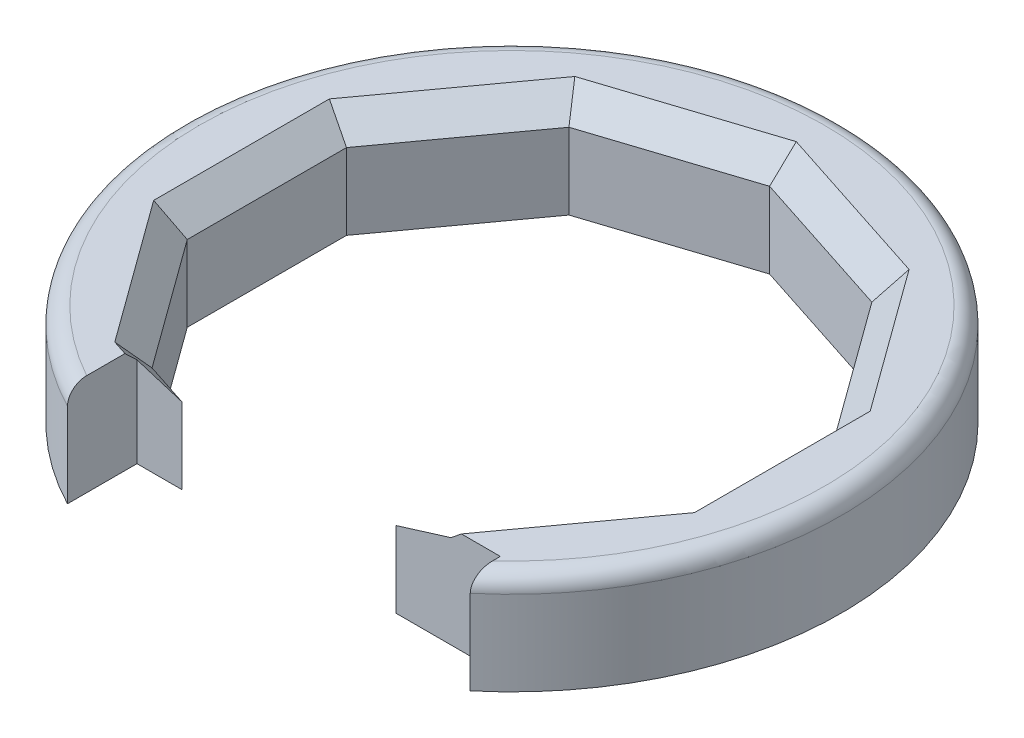
ISO-10303-21;
HEADER;
FILE_DESCRIPTION(('STEP AP214'),'2;1');
FILE_NAME('part.step','',(''),(''),'','','');
FILE_SCHEMA(('AUTOMOTIVE_DESIGN { 1 0 10303 214 1 1 1 1 }'));
ENDSEC;
DATA;
#1=APPLICATION_CONTEXT('core data for automotive mechanical design processes');
#2=APPLICATION_PROTOCOL_DEFINITION('international standard','automotive_design',2000,#1);
#3=PRODUCT_CONTEXT('',#1,'mechanical');
#4=PRODUCT('Part','Part','',(#3));
#5=PRODUCT_RELATED_PRODUCT_CATEGORY('part','',(#4));
#6=PRODUCT_DEFINITION_FORMATION('','',#4);
#7=PRODUCT_DEFINITION_CONTEXT('part definition',#1,'design');
#8=PRODUCT_DEFINITION('design','',#6,#7);
#9=PRODUCT_DEFINITION_SHAPE('','',#8);
#10=(LENGTH_UNIT() NAMED_UNIT(*) SI_UNIT(.MILLI.,.METRE.));
#11=(NAMED_UNIT(*) PLANE_ANGLE_UNIT() SI_UNIT($,.RADIAN.));
#12=(NAMED_UNIT(*) SI_UNIT($,.STERADIAN.) SOLID_ANGLE_UNIT());
#13=UNCERTAINTY_MEASURE_WITH_UNIT(LENGTH_MEASURE(1.E-05),#10,'distance_accuracy_value','');
#14=(GEOMETRIC_REPRESENTATION_CONTEXT(3) GLOBAL_UNCERTAINTY_ASSIGNED_CONTEXT((#13)) GLOBAL_UNIT_ASSIGNED_CONTEXT((#10,
#11,#12)) REPRESENTATION_CONTEXT('',''));
#15=CARTESIAN_POINT('',(0.,0.,0.));
#16=DIRECTION('',(0.,0.,1.));
#17=DIRECTION('',(1.,0.,0.));
#18=AXIS2_PLACEMENT_3D('',#15,#16,#17);
#19=CARTESIAN_POINT('',(0.,12.,0.));
#20=DIRECTION('',(0.,1.,0.));
#21=DIRECTION('',(0.,0.,1.));
#22=AXIS2_PLACEMENT_3D('',#19,#20,#21);
#23=PLANE('',#22);
#24=CARTESIAN_POINT('',(0.,12.,0.));
#25=DIRECTION('',(0.,1.,0.));
#26=DIRECTION('',(0.,0.,1.));
#27=AXIS2_PLACEMENT_3D('',#24,#25,#26);
#28=CIRCLE('',#27,37.);
#29=CARTESIAN_POINT('',(25.,12.,27.2763633939717));
#30=VERTEX_POINT('',#29);
#31=CARTESIAN_POINT('',(-18.,12.,32.3264597504892));
#32=VERTEX_POINT('',#31);
#33=EDGE_CURVE('E333',#30,#32,#28,.T.);
#34=ORIENTED_EDGE('',*,*,#33,.T.);
#35=DIRECTION('',(0.,0.,1.));
#36=VECTOR('',#35,1.);
#37=CARTESIAN_POINT('',(-18.,12.,69.3722257681842));
#38=LINE('',#37,#36);
#39=CARTESIAN_POINT('',(-18.,12.,27.7982366434322));
#40=VERTEX_POINT('',#39);
#41=EDGE_CURVE('E207',#40,#32,#38,.T.);
#42=ORIENTED_EDGE('',*,*,#41,.F.);
#43=DIRECTION('',(-0.951056516295154,0.,-0.309016994374947));
#44=VECTOR('',#43,1.);
#45=CARTESIAN_POINT('',(-9.88854381999829,12.,30.4338085214449));
#46=LINE('',#45,#44);
#47=CARTESIAN_POINT('',(-19.7770876399966,12.,27.2208258672653));
#48=VERTEX_POINT('',#47);
#49=EDGE_CURVE('E365',#40,#48,#46,.T.);
#50=ORIENTED_EDGE('',*,*,#49,.T.);
#51=DIRECTION('',(-0.587785252292473,0.,-0.809016994374947));
#52=VECTOR('',#51,1.);
#53=CARTESIAN_POINT('',(-25.8885438199983,12.,18.8091280733591));
#54=LINE('',#53,#52);
#55=CARTESIAN_POINT('',(-32.,12.,10.397430279453));
#56=VERTEX_POINT('',#55);
#57=EDGE_CURVE('E338',#48,#56,#54,.T.);
#58=ORIENTED_EDGE('',*,*,#57,.T.);
#59=DIRECTION('',(0.,0.,-1.));
#60=VECTOR('',#59,1.);
#61=CARTESIAN_POINT('',(-32.,12.,0.));
#62=LINE('',#61,#60);
#63=CARTESIAN_POINT('',(-32.,12.,-10.397430279453));
#64=VERTEX_POINT('',#63);
#65=EDGE_CURVE('E345',#56,#64,#62,.T.);
#66=ORIENTED_EDGE('',*,*,#65,.T.);
#67=DIRECTION('',(0.587785252292473,0.,-0.809016994374948));
#68=VECTOR('',#67,1.);
#69=CARTESIAN_POINT('',(-25.8885438199983,12.,-18.8091280733591));
#70=LINE('',#69,#68);
#71=CARTESIAN_POINT('',(-19.7770876399966,12.,-27.2208258672653));
#72=VERTEX_POINT('',#71);
#73=EDGE_CURVE('E348',#64,#72,#70,.T.);
#74=ORIENTED_EDGE('',*,*,#73,.T.);
#75=DIRECTION('',(0.951056516295154,0.,-0.309016994374948));
#76=VECTOR('',#75,1.);
#77=CARTESIAN_POINT('',(-9.88854381999832,12.,-30.4338085214449));
#78=LINE('',#77,#76);
#79=CARTESIAN_POINT('',(0.,12.,-33.6467911756245));
#80=VERTEX_POINT('',#79);
#81=EDGE_CURVE('E351',#72,#80,#78,.T.);
#82=ORIENTED_EDGE('',*,*,#81,.T.);
#83=DIRECTION('',(0.951056516295154,0.,0.309016994374947));
#84=VECTOR('',#83,1.);
#85=CARTESIAN_POINT('',(9.88854381999829,12.,-30.4338085214449));
#86=LINE('',#85,#84);
#87=CARTESIAN_POINT('',(19.7770876399966,12.,-27.2208258672653));
#88=VERTEX_POINT('',#87);
#89=EDGE_CURVE('E354',#80,#88,#86,.T.);
#90=ORIENTED_EDGE('',*,*,#89,.T.);
#91=DIRECTION('',(0.587785252292473,0.,0.809016994374948));
#92=VECTOR('',#91,1.);
#93=CARTESIAN_POINT('',(25.8885438199983,12.,-18.8091280733591));
#94=LINE('',#93,#92);
#95=CARTESIAN_POINT('',(32.,12.,-10.397430279453));
#96=VERTEX_POINT('',#95);
#97=EDGE_CURVE('E357',#88,#96,#94,.T.);
#98=ORIENTED_EDGE('',*,*,#97,.T.);
#99=DIRECTION('',(0.,0.,1.));
#100=VECTOR('',#99,1.);
#101=CARTESIAN_POINT('',(32.,12.,0.));
#102=LINE('',#101,#100);
#103=CARTESIAN_POINT('',(32.,12.,10.397430279453));
#104=VERTEX_POINT('',#103);
#105=EDGE_CURVE('E360',#96,#104,#102,.T.);
#106=ORIENTED_EDGE('',*,*,#105,.T.);
#107=DIRECTION('',(-0.587785252292473,0.,0.809016994374948));
#108=VECTOR('',#107,1.);
#109=CARTESIAN_POINT('',(25.8885438199983,12.,18.8091280733591));
#110=LINE('',#109,#108);
#111=CARTESIAN_POINT('',(20.3936317012486,12.,26.3722257681842));
#112=VERTEX_POINT('',#111);
#113=EDGE_CURVE('E218',#104,#112,#110,.T.);
#114=ORIENTED_EDGE('',*,*,#113,.T.);
#115=DIRECTION('',(-1.,0.,0.));
#116=VECTOR('',#115,1.);
#117=CARTESIAN_POINT('',(25.,12.,26.3722257681842));
#118=LINE('',#117,#116);
#119=CARTESIAN_POINT('',(25.,12.,26.3722257681842));
#120=VERTEX_POINT('',#119);
#121=EDGE_CURVE('E206',#120,#112,#118,.T.);
#122=ORIENTED_EDGE('',*,*,#121,.F.);
#123=DIRECTION('',(0.,0.,-1.));
#124=VECTOR('',#123,1.);
#125=CARTESIAN_POINT('',(25.,12.,69.3722257681842));
#126=LINE('',#125,#124);
#127=EDGE_CURVE('E196',#30,#120,#126,.T.);
#128=ORIENTED_EDGE('',*,*,#127,.F.);
#129=EDGE_LOOP('',(#34,#42,#50,#58,#66,#74,#82,#90,#98,#106,#114,#122,#128));
#130=FACE_BOUND('',#129,.T.);
#131=ADVANCED_FACE('F44',(#130),#23,.T.);
#132=CARTESIAN_POINT('',(0.,0.,0.));
#133=DIRECTION('',(0.,1.,0.));
#134=DIRECTION('',(0.,0.,1.));
#135=AXIS2_PLACEMENT_3D('',#132,#133,#134);
#136=PLANE('',#135);
#137=DIRECTION('',(0.,0.,1.));
#138=VECTOR('',#137,1.);
#139=CARTESIAN_POINT('',(-18.,0.,69.3722257681842));
#140=LINE('',#139,#138);
#141=CARTESIAN_POINT('',(-18.,0.,26.3722257681842));
#142=VERTEX_POINT('',#141);
#143=CARTESIAN_POINT('',(-18.,0.,34.5976877840124));
#144=VERTEX_POINT('',#143);
#145=EDGE_CURVE('E225',#142,#144,#140,.T.);
#146=ORIENTED_EDGE('',*,*,#145,.T.);
#147=CARTESIAN_POINT('',(0.,0.,0.));
#148=DIRECTION('',(0.,1.,0.));
#149=DIRECTION('',(0.,0.,1.));
#150=AXIS2_PLACEMENT_3D('',#147,#148,#149);
#151=CIRCLE('',#150,39.);
#152=CARTESIAN_POINT('',(25.,0.,29.9332590941915));
#153=VERTEX_POINT('',#152);
#154=EDGE_CURVE('E326',#153,#144,#151,.T.);
#155=ORIENTED_EDGE('',*,*,#154,.F.);
#156=DIRECTION('',(0.,0.,-1.));
#157=VECTOR('',#156,1.);
#158=CARTESIAN_POINT('',(25.,0.,69.3722257681842));
#159=LINE('',#158,#157);
#160=CARTESIAN_POINT('',(25.,0.,26.3722257681842));
#161=VERTEX_POINT('',#160);
#162=EDGE_CURVE('E229',#153,#161,#159,.T.);
#163=ORIENTED_EDGE('',*,*,#162,.T.);
#164=DIRECTION('',(-1.,0.,0.));
#165=VECTOR('',#164,1.);
#166=CARTESIAN_POINT('',(25.,0.,26.3722257681842));
#167=LINE('',#166,#165);
#168=CARTESIAN_POINT('',(12.6806062620844,0.,26.3722257681842));
#169=VERTEX_POINT('',#168);
#170=EDGE_CURVE('E211',#161,#169,#167,.T.);
#171=ORIENTED_EDGE('',*,*,#170,.T.);
#172=DIRECTION('',(0.951056516295154,0.,-0.309016994374948));
#173=VECTOR('',#172,1.);
#174=CARTESIAN_POINT('',(0.,0.,30.4924045029097));
#175=LINE('',#174,#173);
#176=CARTESIAN_POINT('',(17.922985673747,0.,24.6688734422091));
#177=VERTEX_POINT('',#176);
#178=EDGE_CURVE('E559',#169,#177,#175,.T.);
#179=ORIENTED_EDGE('',*,*,#178,.T.);
#180=DIRECTION('',(0.587785252292473,0.,-0.809016994374947));
#181=VECTOR('',#180,1.);
#182=CARTESIAN_POINT('',(17.922985673747,0.,24.6688734422091));
#183=LINE('',#182,#181);
#184=CARTESIAN_POINT('',(29.,0.,9.42267119075428));
#185=VERTEX_POINT('',#184);
#186=EDGE_CURVE('E498',#177,#185,#183,.T.);
#187=ORIENTED_EDGE('',*,*,#186,.T.);
#188=DIRECTION('',(0.,0.,-1.));
#189=VECTOR('',#188,1.);
#190=CARTESIAN_POINT('',(29.,0.,9.42267119075428));
#191=LINE('',#190,#189);
#192=CARTESIAN_POINT('',(29.,0.,-9.42267119075429));
#193=VERTEX_POINT('',#192);
#194=EDGE_CURVE('E540',#185,#193,#191,.T.);
#195=ORIENTED_EDGE('',*,*,#194,.T.);
#196=DIRECTION('',(-0.587785252292473,0.,-0.809016994374948));
#197=VECTOR('',#196,1.);
#198=CARTESIAN_POINT('',(29.,0.,-9.42267119075429));
#199=LINE('',#198,#197);
#200=CARTESIAN_POINT('',(17.9229856737469,0.,-24.6688734422092));
#201=VERTEX_POINT('',#200);
#202=EDGE_CURVE('E432',#193,#201,#199,.T.);
#203=ORIENTED_EDGE('',*,*,#202,.T.);
#204=DIRECTION('',(-0.951056516295154,0.,-0.309016994374947));
#205=VECTOR('',#204,1.);
#206=CARTESIAN_POINT('',(17.9229856737469,0.,-24.6688734422092));
#207=LINE('',#206,#205);
#208=CARTESIAN_POINT('',(0.,0.,-30.4924045029097));
#209=VERTEX_POINT('',#208);
#210=EDGE_CURVE('E532',#201,#209,#207,.T.);
#211=ORIENTED_EDGE('',*,*,#210,.T.);
#212=DIRECTION('',(-0.951056516295154,0.,0.309016994374948));
#213=VECTOR('',#212,1.);
#214=CARTESIAN_POINT('',(0.,0.,-30.4924045029097));
#215=LINE('',#214,#213);
#216=CARTESIAN_POINT('',(-17.922985673747,0.,-24.6688734422091));
#217=VERTEX_POINT('',#216);
#218=EDGE_CURVE('E537',#209,#217,#215,.T.);
#219=ORIENTED_EDGE('',*,*,#218,.T.);
#220=DIRECTION('',(-0.587785252292473,0.,0.809016994374948));
#221=VECTOR('',#220,1.);
#222=CARTESIAN_POINT('',(-17.922985673747,0.,-24.6688734422091));
#223=LINE('',#222,#221);
#224=CARTESIAN_POINT('',(-29.,0.,-9.42267119075427));
#225=VERTEX_POINT('',#224);
#226=EDGE_CURVE('E546',#217,#225,#223,.T.);
#227=ORIENTED_EDGE('',*,*,#226,.T.);
#228=DIRECTION('',(0.,0.,1.));
#229=VECTOR('',#228,1.);
#230=CARTESIAN_POINT('',(-29.,0.,-9.42267119075427));
#231=LINE('',#230,#229);
#232=CARTESIAN_POINT('',(-29.,0.,9.42267119075429));
#233=VERTEX_POINT('',#232);
#234=EDGE_CURVE('E550',#225,#233,#231,.T.);
#235=ORIENTED_EDGE('',*,*,#234,.T.);
#236=DIRECTION('',(0.587785252292473,0.,0.809016994374947));
#237=VECTOR('',#236,1.);
#238=CARTESIAN_POINT('',(-29.,0.,9.42267119075429));
#239=LINE('',#238,#237);
#240=CARTESIAN_POINT('',(-17.922985673747,0.,24.6688734422091));
#241=VERTEX_POINT('',#240);
#242=EDGE_CURVE('E554',#233,#241,#239,.T.);
#243=ORIENTED_EDGE('',*,*,#242,.T.);
#244=DIRECTION('',(0.951056516295154,0.,0.309016994374947));
#245=VECTOR('',#244,1.);
#246=CARTESIAN_POINT('',(-17.922985673747,0.,24.6688734422091));
#247=LINE('',#246,#245);
#248=CARTESIAN_POINT('',(-12.6806062620843,0.,26.3722257681842));
#249=VERTEX_POINT('',#248);
#250=EDGE_CURVE('E447',#241,#249,#247,.T.);
#251=ORIENTED_EDGE('',*,*,#250,.T.);
#252=EDGE_CURVE('E232',#249,#142,#167,.T.);
#253=ORIENTED_EDGE('',*,*,#252,.T.);
#254=EDGE_LOOP('',(#146,#155,#163,#171,#179,#187,#195,#203,#211,#219,#227,#235,#243,#251,#253));
#255=FACE_BOUND('',#254,.T.);
#256=ADVANCED_FACE('F312',(#255),#136,.F.);
#257=CARTESIAN_POINT('',(0.,12.,0.));
#258=DIRECTION('',(0.,-1.,0.));
#259=DIRECTION('',(0.,0.,-1.));
#260=AXIS2_PLACEMENT_3D('',#257,#258,#259);
#261=CYLINDRICAL_SURFACE('',#260,39.);
#262=DIRECTION('',(0.,-1.,0.));
#263=VECTOR('',#262,1.);
#264=CARTESIAN_POINT('',(-18.,12.,34.5976877840124));
#265=LINE('',#264,#263);
#266=CARTESIAN_POINT('',(-18.,10.,34.5976877840124));
#267=VERTEX_POINT('',#266);
#268=EDGE_CURVE('E254',#267,#144,#265,.T.);
#269=ORIENTED_EDGE('',*,*,#268,.F.);
#270=CARTESIAN_POINT('',(0.,10.,0.));
#271=DIRECTION('',(0.,1.,0.));
#272=DIRECTION('',(0.,0.,1.));
#273=AXIS2_PLACEMENT_3D('',#270,#271,#272);
#274=CIRCLE('',#273,39.);
#275=CARTESIAN_POINT('',(25.,10.,29.9332590941915));
#276=VERTEX_POINT('',#275);
#277=EDGE_CURVE('E324',#267,#276,#274,.F.);
#278=ORIENTED_EDGE('',*,*,#277,.T.);
#279=DIRECTION('',(0.,-1.,0.));
#280=VECTOR('',#279,1.);
#281=CARTESIAN_POINT('',(25.,12.,29.9332590941915));
#282=LINE('',#281,#280);
#283=EDGE_CURVE('E329',#153,#276,#282,.F.);
#284=ORIENTED_EDGE('',*,*,#283,.F.);
#285=ORIENTED_EDGE('',*,*,#154,.T.);
#286=EDGE_LOOP('',(#269,#278,#284,#285));
#287=FACE_BOUND('',#286,.T.);
#288=ADVANCED_FACE('F284',(#287),#261,.T.);
#289=CARTESIAN_POINT('',(-17.922985673747,12.,24.6688734422091));
#290=DIRECTION('',(0.309016994374947,0.,-0.951056516295154));
#291=DIRECTION('',(-0.951056516295154,0.,-0.309016994374947));
#292=AXIS2_PLACEMENT_3D('',#289,#290,#291);
#293=PLANE('',#292);
#294=DIRECTION('',(0.951056516295154,0.,0.309016994374947));
#295=VECTOR('',#294,1.);
#296=CARTESIAN_POINT('',(-17.922985673747,9.00000000000002,24.6688734422091));
#297=LINE('',#296,#295);
#298=CARTESIAN_POINT('',(-17.922985673747,9.00000000000003,24.6688734422091));
#299=VERTEX_POINT('',#298);
#300=CARTESIAN_POINT('',(-12.6806062620843,9.00000000000002,26.3722257681842));
#301=VERTEX_POINT('',#300);
#302=EDGE_CURVE('E332',#299,#301,#297,.T.);
#303=ORIENTED_EDGE('',*,*,#302,.T.);
#304=DIRECTION('',(0.,-1.,0.));
#305=VECTOR('',#304,1.);
#306=CARTESIAN_POINT('',(-12.6806062620843,12.,26.3722257681842));
#307=LINE('',#306,#305);
#308=EDGE_CURVE('E74',#301,#249,#307,.T.);
#309=ORIENTED_EDGE('',*,*,#308,.T.);
#310=ORIENTED_EDGE('',*,*,#250,.F.);
#311=DIRECTION('',(0.,-1.,0.));
#312=VECTOR('',#311,1.);
#313=CARTESIAN_POINT('',(-17.922985673747,12.,24.6688734422091));
#314=LINE('',#313,#312);
#315=EDGE_CURVE('E449',#299,#241,#314,.T.);
#316=ORIENTED_EDGE('',*,*,#315,.F.);
#317=EDGE_LOOP('',(#303,#309,#310,#316));
#318=FACE_BOUND('',#317,.T.);
#319=ADVANCED_FACE('F280',(#318),#293,.T.);
#320=CARTESIAN_POINT('',(0.,12.,30.4924045029097));
#321=DIRECTION('',(-0.309016994374948,0.,-0.951056516295153));
#322=DIRECTION('',(-0.951056516295154,0.,0.309016994374948));
#323=AXIS2_PLACEMENT_3D('',#320,#321,#322);
#324=PLANE('',#323);
#325=ORIENTED_EDGE('',*,*,#178,.F.);
#326=DIRECTION('',(0.,1.,0.));
#327=VECTOR('',#326,1.);
#328=CARTESIAN_POINT('',(12.6806062620843,12.,26.3722257681842));
#329=LINE('',#328,#327);
#330=CARTESIAN_POINT('',(12.6806062620843,9.00000000000002,26.3722257681842));
#331=VERTEX_POINT('',#330);
#332=EDGE_CURVE('E242',#169,#331,#329,.T.);
#333=ORIENTED_EDGE('',*,*,#332,.T.);
#334=DIRECTION('',(0.951056516295154,0.,-0.309016994374948));
#335=VECTOR('',#334,1.);
#336=CARTESIAN_POINT('',(0.,9.00000000000002,30.4924045029097));
#337=LINE('',#336,#335);
#338=CARTESIAN_POINT('',(17.922985673747,9.00000000000002,24.6688734422091));
#339=VERTEX_POINT('',#338);
#340=EDGE_CURVE('E368',#331,#339,#337,.T.);
#341=ORIENTED_EDGE('',*,*,#340,.T.);
#342=DIRECTION('',(0.,-1.,0.));
#343=VECTOR('',#342,1.);
#344=CARTESIAN_POINT('',(17.922985673747,12.,24.6688734422091));
#345=LINE('',#344,#343);
#346=EDGE_CURVE('E495',#339,#177,#345,.T.);
#347=ORIENTED_EDGE('',*,*,#346,.T.);
#348=EDGE_LOOP('',(#325,#333,#341,#347));
#349=FACE_BOUND('',#348,.T.);
#350=ADVANCED_FACE('F277',(#349),#324,.T.);
#351=CARTESIAN_POINT('',(0.,10.,0.));
#352=DIRECTION('',(0.,1.,0.));
#353=DIRECTION('',(0.,0.,1.));
#354=AXIS2_PLACEMENT_3D('',#351,#352,#353);
#355=TOROIDAL_SURFACE('',#354,37.,2.);
#356=ORIENTED_EDGE('',*,*,#277,.F.);
#357=CARTESIAN_POINT('',(-18.,10.9952612771041,30.3254987922168));
#358=CARTESIAN_POINT('',(-18.,10.9111722722806,30.2693981909654));
#359=CARTESIAN_POINT('',(-18.,10.822712948693,30.2198129162246));
#360=CARTESIAN_POINT('',(-18.,10.6388319335769,30.1357761297655));
#361=CARTESIAN_POINT('',(-18.,10.5434110188061,30.1013229326488));
#362=CARTESIAN_POINT('',(-18.,10.347737059016,30.0491924932674));
#363=CARTESIAN_POINT('',(-18.,10.2474699424023,30.0315676235605));
#364=CARTESIAN_POINT('',(-18.,10.0454003342236,30.0142745292004));
#365=CARTESIAN_POINT('',(-18.,9.94359814099844,30.0146028592128));
#366=CARTESIAN_POINT('',(-18.,9.74593506842754,30.0327884447302));
#367=CARTESIAN_POINT('',(-18.,9.65000474062354,30.0499055169759));
#368=CARTESIAN_POINT('',(-18.,9.4622915461142,30.0996944312341));
#369=CARTESIAN_POINT('',(-18.,9.37050902591148,30.1323675701606));
#370=CARTESIAN_POINT('',(-18.,9.19143674561947,30.2125835514364));
#371=CARTESIAN_POINT('',(-18.,9.10427965408775,30.2604207512989));
#372=CARTESIAN_POINT('',(-18.,8.93826024437952,30.3687599406922));
#373=CARTESIAN_POINT('',(-18.,8.85940058728135,30.4292659747679));
#374=CARTESIAN_POINT('',(-18.,8.70362208046255,30.567565812838));
#375=CARTESIAN_POINT('',(-18.,8.62770897290607,30.6464899470992));
#376=CARTESIAN_POINT('',(-18.,8.48828646834104,30.8146006936807));
#377=CARTESIAN_POINT('',(-18.,8.42478322940788,30.9037923662939));
#378=CARTESIAN_POINT('',(-18.,8.30289589348114,31.1028577382312));
#379=CARTESIAN_POINT('',(-18.,8.24640463306039,31.2138908997724));
#380=CARTESIAN_POINT('',(-18.,8.15056069306116,31.4431177156458));
#381=CARTESIAN_POINT('',(-18.,8.11121704068945,31.5613151043187));
#382=CARTESIAN_POINT('',(-18.,8.04621347459826,31.816700647896));
#383=CARTESIAN_POINT('',(-18.,8.02277897145003,31.9544587814126));
#384=CARTESIAN_POINT('',(-18.,7.99800259805519,32.2319775758248));
#385=CARTESIAN_POINT('',(-18.,7.99667016746106,32.3717390668379));
#386=CARTESIAN_POINT('',(-18.,8.01687529969761,32.6574600820438));
#387=CARTESIAN_POINT('',(-18.,8.03968720077496,32.8033327122833));
#388=CARTESIAN_POINT('',(-18.,8.11034563654951,33.0889562855146));
#389=CARTESIAN_POINT('',(-18.,8.15819276104268,33.2287070842002));
#390=CARTESIAN_POINT('',(-18.,8.27659807333665,33.4924189135829));
#391=CARTESIAN_POINT('',(-18.,8.3462987019749,33.6167623234717));
#392=CARTESIAN_POINT('',(-18.,8.50798958358936,33.8500611695678));
#393=CARTESIAN_POINT('',(-18.,8.59996275045638,33.959028300569));
#394=CARTESIAN_POINT('',(-18.,8.79303548613129,34.1453147623996));
#395=CARTESIAN_POINT('',(-18.,8.89205258143641,34.2247876982027));
#396=CARTESIAN_POINT('',(-18.,9.10359107464411,34.3630888955123));
#397=CARTESIAN_POINT('',(-18.,9.21609803367435,34.421938970571));
#398=CARTESIAN_POINT('',(-18.,9.43591180456881,34.509615314664));
#399=CARTESIAN_POINT('',(-18.,9.54208575903209,34.5412915356088));
#400=CARTESIAN_POINT('',(-18.,9.75843630736772,34.5846006603623));
#401=CARTESIAN_POINT('',(-18.,9.86861048558564,34.5962454617515));
#402=CARTESIAN_POINT('',(-18.,10.0802117278609,34.5987719760141));
#403=CARTESIAN_POINT('',(-18.,10.1816232468074,34.5912616000032));
#404=CARTESIAN_POINT('',(-18.,10.3816914210125,34.559174365877));
#405=CARTESIAN_POINT('',(-18.,10.4803483947912,34.5345994895775));
#406=CARTESIAN_POINT('',(-18.,10.6715383079378,34.4697149412842));
#407=CARTESIAN_POINT('',(-18.,10.7641092542722,34.4295165252273));
#408=CARTESIAN_POINT('',(-18.,10.9417148080781,34.3350025131554));
#409=CARTESIAN_POINT('',(-18.,11.0267479461569,34.2806841727341));
#410=CARTESIAN_POINT('',(-18.,11.192474846433,34.156206243085));
#411=CARTESIAN_POINT('',(-18.,11.2725981041562,34.0852891545414));
#412=CARTESIAN_POINT('',(-18.,11.421172935994,33.9321593860183));
#413=CARTESIAN_POINT('',(-18.,11.4896201066533,33.8499424654967));
#414=CARTESIAN_POINT('',(-18.,11.6204894513748,33.6675298449884));
#415=CARTESIAN_POINT('',(-18.,11.6815434288764,33.5663535553741));
#416=CARTESIAN_POINT('',(-18.,11.7878408890898,33.3560271335115));
#417=CARTESIAN_POINT('',(-18.,11.8330770165967,33.246873320208));
#418=CARTESIAN_POINT('',(-18.,11.9118626173134,33.0101813165961));
#419=CARTESIAN_POINT('',(-18.,11.9434340038797,32.881983646268));
#420=CARTESIAN_POINT('',(-18.,11.9865856424389,32.6222685643167));
#421=CARTESIAN_POINT('',(-18.,11.9981574709952,32.4907497775519));
#422=CARTESIAN_POINT('',(-18.,12.0015840531533,32.2155424417716));
#423=CARTESIAN_POINT('',(-18.,11.9915637457434,32.0718275128002));
#424=CARTESIAN_POINT('',(-18.,11.9481227673958,31.7878797253091));
#425=CARTESIAN_POINT('',(-18.,11.9146871531933,31.6476491496559));
#426=CARTESIAN_POINT('',(-18.,11.8236856285395,31.3717040361156));
#427=CARTESIAN_POINT('',(-18.,11.7655969305542,31.2361605644591));
#428=CARTESIAN_POINT('',(-18.,11.6257777667668,30.9779277335075));
#429=CARTESIAN_POINT('',(-18.,11.5440839154854,30.855218864606));
#430=CARTESIAN_POINT('',(-18.,11.3857807708896,30.6617646012536));
#431=CARTESIAN_POINT('',(-18.,11.3147983117126,30.5863769681096));
#432=CARTESIAN_POINT('',(-18.,11.1624793400011,30.4468985927346));
#433=CARTESIAN_POINT('',(-18.,11.0811500050675,30.3828000920667));
#434=CARTESIAN_POINT('',(-18.,10.9952612771041,30.3254987922168));
#435=B_SPLINE_CURVE_WITH_KNOTS('',3,(#357,#358,#359,#360,#361,#362,#363,#364,#365,#366,#367,
#368,#369,#370,#371,#372,#373,#374,#375,#376,#377,#378,#379,#380,#381,#382,#383,#384,#385,#386,
#387,#388,#389,#390,#391,#392,#393,#394,#395,#396,#397,#398,#399,#400,#401,#402,#403,#404,#405,
#406,#407,#408,#409,#410,#411,#412,#413,#414,#415,#416,#417,#418,#419,#420,#421,#422,#423,#424,
#425,#426,#427,#428,#429,#430,#431,#432,#433,#434),.UNSPECIFIED.,.T.,.F.,(4,2,2,2,2,2,2,2,2,2,2,
2,2,2,2,2,2,2,2,2,2,2,2,2,2,2,2,2,2,2,2,2,2,2,2,2,2,2,4),(0.,0.302942727704039,
0.605851705332646,0.90970034268242,1.21349066973186,1.50446315772489,1.79545990842928,
2.0924922361343,2.38961953685291,2.71684425809675,3.04423094608698,3.41646411223256,
3.78889300124064,4.20628378800634,4.62385283509457,5.06461418723964,5.5053859235931,
5.93066201322266,6.35561288520887,6.73431752240656,7.11262037216366,7.44322577630842,
7.7736347508274,8.07723679228668,8.38080358028697,8.68224713399701,8.98374932137636,
9.30342489967857,9.62322077340579,9.97629549475337,10.3295341760733,10.7239670366938,
11.1185659845484,11.5488017666883,11.9793123687547,12.4194482540324,12.8589050655771,
13.1685451917515,13.4779716807779),.UNSPECIFIED.);
#436=EDGE_CURVE('E246',#267,#32,#435,.T.);
#437=ORIENTED_EDGE('',*,*,#436,.T.);
#438=ORIENTED_EDGE('',*,*,#33,.F.);
#439=CARTESIAN_POINT('',(25.,11.9955916737211,27.0960612717812));
#440=CARTESIAN_POINT('',(25.,12.0038248967761,27.264457270093));
#441=CARTESIAN_POINT('',(25.,12.0005768037664,27.433584270131));
#442=CARTESIAN_POINT('',(25.,11.9703805329871,27.7700438676571));
#443=CARTESIAN_POINT('',(25.,11.9433840651501,27.9373721054013));
#444=CARTESIAN_POINT('',(25.,11.8665413765461,28.2570137186921));
#445=CARTESIAN_POINT('',(25.,11.8180415368317,28.4096456799283));
#446=CARTESIAN_POINT('',(25.,11.6972817549342,28.7051995283264));
#447=CARTESIAN_POINT('',(25.,11.6250582242134,28.8481358933308));
#448=CARTESIAN_POINT('',(25.,11.475507878504,29.0866087375413));
#449=CARTESIAN_POINT('',(25.,11.4033673315791,29.1853913132485));
#450=CARTESIAN_POINT('',(25.,11.2441898609001,29.3701770774643));
#451=CARTESIAN_POINT('',(25.,11.1571719027689,29.456196279029));
#452=CARTESIAN_POINT('',(25.,10.9863450593367,29.5966404990481));
#453=CARTESIAN_POINT('',(25.,10.9049291140788,29.6539663592749));
#454=CARTESIAN_POINT('',(25.,10.7337159754156,29.7544469145172));
#455=CARTESIAN_POINT('',(25.,10.6439228195987,29.7976083915275));
#456=CARTESIAN_POINT('',(25.,10.4573436513472,29.8673608501888));
#457=CARTESIAN_POINT('',(25.,10.3605145817073,29.8938381728106));
#458=CARTESIAN_POINT('',(25.,10.1635745205121,29.927746147297));
#459=CARTESIAN_POINT('',(25.,10.0634655696147,29.9351884226288));
#460=CARTESIAN_POINT('',(25.,9.87520416375868,29.9307377080506));
#461=CARTESIAN_POINT('',(25.,9.7869944961063,29.9209599948751));
#462=CARTESIAN_POINT('',(25.,9.61351167257921,29.8866823079773));
#463=CARTESIAN_POINT('',(25.,9.52823835975428,29.8621831224236));
#464=CARTESIAN_POINT('',(25.,9.36284559230257,29.7999170385157));
#465=CARTESIAN_POINT('',(25.,9.28272049058442,29.7621649817088));
#466=CARTESIAN_POINT('',(25.,9.12895991665155,29.6752423990584));
#467=CARTESIAN_POINT('',(25.,9.05532754250147,29.6260664624459));
#468=CARTESIAN_POINT('',(25.,8.88889185127032,29.4977559363424));
#469=CARTESIAN_POINT('',(25.,8.79938945169483,29.4143287192444));
#470=CARTESIAN_POINT('',(25.,8.63518093736125,29.2339959929036));
#471=CARTESIAN_POINT('',(25.,8.56050234565943,29.1370659705189));
#472=CARTESIAN_POINT('',(25.,8.4055847296354,28.9028256780157));
#473=CARTESIAN_POINT('',(25.,8.33044671596842,28.7621469030186));
#474=CARTESIAN_POINT('',(25.,8.20388034885742,28.4705880580584));
#475=CARTESIAN_POINT('',(25.,8.15248104803859,28.3196957457111));
#476=CARTESIAN_POINT('',(25.,8.06209257532799,27.9742892699165));
#477=CARTESIAN_POINT('',(25.,8.02925396718198,27.7781651407297));
#478=CARTESIAN_POINT('',(25.,7.9961159281601,27.3831617294404));
#479=CARTESIAN_POINT('',(25.,7.99584911278071,27.1842798851583));
#480=CARTESIAN_POINT('',(25.,8.02703688301167,26.7874309178639));
#481=CARTESIAN_POINT('',(25.,8.05874353944213,26.5894836198613));
#482=CARTESIAN_POINT('',(25.,8.15461616763487,26.2016033799523));
#483=CARTESIAN_POINT('',(25.,8.21874496961333,26.0116615298847));
#484=CARTESIAN_POINT('',(25.,8.35840121912309,25.6980107088951));
#485=CARTESIAN_POINT('',(25.,8.42572430051655,25.5706353017782));
#486=CARTESIAN_POINT('',(25.,8.57915897164442,25.3276957948405));
#487=CARTESIAN_POINT('',(25.,8.66524055484478,25.2121132595049));
#488=CARTESIAN_POINT('',(25.,8.83228421534691,25.0261097995506));
#489=CARTESIAN_POINT('',(25.,8.90882968421515,24.9517335839459));
#490=CARTESIAN_POINT('',(25.,9.07273251845355,24.8159672951839));
#491=CARTESIAN_POINT('',(25.,9.16007480292978,24.7545594257441));
#492=CARTESIAN_POINT('',(25.,9.32702552438529,24.6588179725384));
#493=CARTESIAN_POINT('',(25.,9.40494588624794,24.621556447229));
#494=CARTESIAN_POINT('',(25.,9.56590967645443,24.5604563241425));
#495=CARTESIAN_POINT('',(25.,9.64894929115744,24.5366078650936));
#496=CARTESIAN_POINT('',(25.,9.81845600018413,24.5040636661687));
#497=CARTESIAN_POINT('',(25.,9.90493899295774,24.4954493014298));
#498=CARTESIAN_POINT('',(25.,10.077999595835,24.4943975480578));
#499=CARTESIAN_POINT('',(25.,10.1645771910223,24.5019578982357));
#500=CARTESIAN_POINT('',(25.,10.3277126137678,24.5312690493245));
#501=CARTESIAN_POINT('',(25.,10.4045007200299,24.5517728349196));
#502=CARTESIAN_POINT('',(25.,10.5539626395742,24.6043826410172));
#503=CARTESIAN_POINT('',(25.,10.6266347799171,24.636493340571));
#504=CARTESIAN_POINT('',(25.,10.7908746776656,24.7233857888587));
#505=CARTESIAN_POINT('',(25.,10.8803257219517,24.7821668345098));
#506=CARTESIAN_POINT('',(25.,11.0485019864425,24.9134433336389));
#507=CARTESIAN_POINT('',(25.,11.1272072028617,24.9859637803992));
#508=CARTESIAN_POINT('',(25.,11.3007320590425,25.1698906630965));
#509=CARTESIAN_POINT('',(25.,11.3907916150311,25.2857751524644));
#510=CARTESIAN_POINT('',(25.,11.5514081124229,25.5303729953848));
#511=CARTESIAN_POINT('',(25.,11.6219216390145,25.659114056854));
#512=CARTESIAN_POINT('',(25.,11.7642926078148,25.9680605584469));
#513=CARTESIAN_POINT('',(25.,11.8292202767421,26.1514523637891));
#514=CARTESIAN_POINT('',(25.,11.9283169533016,26.5259071851065));
#515=CARTESIAN_POINT('',(25.,11.9625433141586,26.7169551977515));
#516=CARTESIAN_POINT('',(25.,11.9879164730729,26.9714025429449));
#517=CARTESIAN_POINT('',(25.,11.9925418121002,27.0336817529776));
#518=CARTESIAN_POINT('',(25.,11.9955916737211,27.0960612717812));
#519=B_SPLINE_CURVE_WITH_KNOTS('',3,(#439,#440,#441,#442,#443,#444,#445,#446,#447,#448,#449,
#450,#451,#452,#453,#454,#455,#456,#457,#458,#459,#460,#461,#462,#463,#464,#465,#466,#467,#468,
#469,#470,#471,#472,#473,#474,#475,#476,#477,#478,#479,#480,#481,#482,#483,#484,#485,#486,#487,
#488,#489,#490,#491,#492,#493,#494,#495,#496,#497,#498,#499,#500,#501,#502,#503,#504,#505,#506,
#507,#508,#509,#510,#511,#512,#513,#514,#515,#516,#517,#518),.UNSPECIFIED.,.T.,.F.,(4,2,2,2,2,2,
2,2,2,2,2,2,2,2,2,2,2,2,2,2,2,2,2,2,2,2,2,2,2,2,2,2,2,2,2,2,2,2,2,4),(0.,0.50568236211702,
1.01239536435501,1.4910825856844,1.96903851731468,2.33469375682299,2.69988629053215,
2.99741210869209,3.2947952610849,3.59418300423434,3.89338788703766,4.15835147728169,
4.42330088298277,4.68795452028526,4.95273376376302,5.31779259766324,5.68352301607427,
6.15941944711993,6.63589677066356,7.22942555802035,7.82354866567052,8.4223925954093,
9.02055154283507,9.45141511571497,9.88159446338169,10.2007054048444,10.5193755475565,
10.7774426939296,11.0353198607687,11.2945704021065,11.5537847031672,11.7911969777593,
12.0287050663934,12.34804615915,12.6679738407035,13.1058764769439,13.5447441091936,
14.1254379642301,14.7050447500493,14.892366436625),.UNSPECIFIED.);
#520=EDGE_CURVE('E11',#30,#276,#519,.T.);
#521=ORIENTED_EDGE('',*,*,#520,.T.);
#522=EDGE_LOOP('',(#356,#437,#438,#521));
#523=FACE_BOUND('',#522,.T.);
#524=ADVANCED_FACE('F256',(#523),#355,.T.);
#525=CARTESIAN_POINT('',(17.922985673747,9.00000000000002,24.6688734422091));
#526=DIRECTION('',(0.572061402817683,-0.707106781186549,0.415626937777453));
#527=DIRECTION('',(0.587785252292473,0.,-0.809016994374948));
#528=AXIS2_PLACEMENT_3D('',#525,#526,#527);
#529=PLANE('',#528);
#530=DIRECTION('',(0.425919209711473,0.689151757774651,0.586227499828235));
#531=VECTOR('',#530,1.);
#532=CARTESIAN_POINT('',(16.1256790832004,6.09189684829147,22.1950931454372));
#533=LINE('',#532,#531);
#534=CARTESIAN_POINT('',(19.1605435787447,11.0024107533325,26.3722257681842));
#535=VERTEX_POINT('',#534);
#536=EDGE_CURVE('E400',#535,#339,#533,.F.);
#537=ORIENTED_EDGE('',*,*,#536,.F.);
#538=DIRECTION('',(-0.777437524821137,-0.628960169645092,0.));
#539=VECTOR('',#538,1.);
#540=CARTESIAN_POINT('',(17.4334190344946,9.60513764563206,26.3722257681842));
#541=LINE('',#540,#539);
#542=EDGE_CURVE('E66',#535,#112,#541,.F.);
#543=ORIENTED_EDGE('',*,*,#542,.T.);
#544=ORIENTED_EDGE('',*,*,#113,.F.);
#545=DIRECTION('',(0.689151757774652,0.68915175777465,0.223918979794515));
#546=VECTOR('',#545,1.);
#547=CARTESIAN_POINT('',(26.0918968482915,6.09189684829154,8.47777119808719));
#548=LINE('',#547,#546);
#549=CARTESIAN_POINT('',(29.,9.00000000000002,9.42267119075428));
#550=VERTEX_POINT('',#549);
#551=EDGE_CURVE('E408',#104,#550,#548,.F.);
#552=ORIENTED_EDGE('',*,*,#551,.T.);
#553=DIRECTION('',(0.587785252292473,0.,-0.809016994374948));
#554=VECTOR('',#553,1.);
#555=CARTESIAN_POINT('',(17.922985673747,9.00000000000002,24.6688734422091));
#556=LINE('',#555,#554);
#557=EDGE_CURVE('E371',#339,#550,#556,.T.);
#558=ORIENTED_EDGE('',*,*,#557,.F.);
#559=EDGE_LOOP('',(#537,#543,#544,#552,#558));
#560=FACE_BOUND('',#559,.T.);
#561=ADVANCED_FACE('F488',(#560),#529,.F.);
#562=CARTESIAN_POINT('',(0.,9.00000000000002,30.4924045029097));
#563=DIRECTION('',(0.218508012224411,-0.707106781186548,0.672498511963957));
#564=DIRECTION('',(0.951056516295154,0.,-0.309016994374948));
#565=AXIS2_PLACEMENT_3D('',#562,#563,#564);
#566=PLANE('',#565);
#567=ORIENTED_EDGE('',*,*,#340,.F.);
#568=DIRECTION('',(-0.955422563220238,-0.295241808844326,0.));
#569=VECTOR('',#568,1.);
#570=CARTESIAN_POINT('',(1.10533960823208,5.42304588953805,26.3722257681842));
#571=LINE('',#570,#569);
#572=EDGE_CURVE('E237',#331,#535,#571,.F.);
#573=ORIENTED_EDGE('',*,*,#572,.T.);
#574=ORIENTED_EDGE('',*,*,#536,.T.);
#575=EDGE_LOOP('',(#567,#573,#574));
#576=FACE_BOUND('',#575,.T.);
#577=ADVANCED_FACE('F492',(#576),#566,.F.);
#578=CARTESIAN_POINT('',(-17.922985673747,9.00000000000002,24.6688734422091));
#579=DIRECTION('',(-0.21850801222441,-0.707106781186548,0.672498511963957));
#580=DIRECTION('',(0.951056516295154,0.,0.309016994374947));
#581=AXIS2_PLACEMENT_3D('',#578,#579,#580);
#582=PLANE('',#581);
#583=ORIENTED_EDGE('',*,*,#49,.F.);
#584=DIRECTION('',(0.,0.689151757774651,0.724617040067447));
#585=VECTOR('',#584,1.);
#586=CARTESIAN_POINT('',(-18.,9.01249599865672,24.6569890412591));
#587=LINE('',#586,#585);
#588=CARTESIAN_POINT('',(-18.,10.6437830647876,26.3722257681842));
#589=VERTEX_POINT('',#588);
#590=EDGE_CURVE('E59',#40,#589,#587,.F.);
#591=ORIENTED_EDGE('',*,*,#590,.T.);
#592=DIRECTION('',(-0.955422563220239,0.295241808844326,0.));
#593=VECTOR('',#592,1.);
#594=CARTESIAN_POINT('',(-17.46601938323,10.4787739795389,26.3722257681842));
#595=LINE('',#594,#593);
#596=EDGE_CURVE('E395',#589,#301,#595,.F.);
#597=ORIENTED_EDGE('',*,*,#596,.T.);
#598=ORIENTED_EDGE('',*,*,#302,.F.);
#599=DIRECTION('',(0.425919209711469,-0.689151757774651,-0.586227499828237));
#600=VECTOR('',#599,1.);
#601=CARTESIAN_POINT('',(-17.922985673747,9.00000000000002,24.6688734422091));
#602=LINE('',#601,#600);
#603=EDGE_CURVE('E396',#299,#48,#602,.F.);
#604=ORIENTED_EDGE('',*,*,#603,.T.);
#605=EDGE_LOOP('',(#583,#591,#597,#598,#604));
#606=FACE_BOUND('',#605,.T.);
#607=ADVANCED_FACE('F308',(#606),#582,.F.);
#608=CARTESIAN_POINT('',(29.,12.,-9.42267119075429));
#609=DIRECTION('',(-0.809016994374947,0.,0.587785252292473));
#610=DIRECTION('',(0.587785252292473,0.,0.809016994374948));
#611=AXIS2_PLACEMENT_3D('',#608,#609,#610);
#612=PLANE('',#611);
#613=DIRECTION('',(0.,-1.,0.));
#614=VECTOR('',#613,1.);
#615=CARTESIAN_POINT('',(29.,12.,-9.42267119075429));
#616=LINE('',#615,#614);
#617=CARTESIAN_POINT('',(29.,9.00000000000002,-9.42267119075429));
#618=VERTEX_POINT('',#617);
#619=EDGE_CURVE('E507',#618,#193,#616,.T.);
#620=ORIENTED_EDGE('',*,*,#619,.F.);
#621=DIRECTION('',(-0.587785252292473,0.,-0.809016994374948));
#622=VECTOR('',#621,1.);
#623=CARTESIAN_POINT('',(29.,9.00000000000002,-9.42267119075429));
#624=LINE('',#623,#622);
#625=CARTESIAN_POINT('',(17.9229856737469,9.00000000000003,-24.6688734422092));
#626=VERTEX_POINT('',#625);
#627=EDGE_CURVE('E377',#618,#626,#624,.T.);
#628=ORIENTED_EDGE('',*,*,#627,.T.);
#629=DIRECTION('',(0.,-1.,0.));
#630=VECTOR('',#629,1.);
#631=CARTESIAN_POINT('',(17.9229856737469,12.,-24.6688734422092));
#632=LINE('',#631,#630);
#633=EDGE_CURVE('E522',#626,#201,#632,.T.);
#634=ORIENTED_EDGE('',*,*,#633,.T.);
#635=ORIENTED_EDGE('',*,*,#202,.F.);
#636=EDGE_LOOP('',(#620,#628,#634,#635));
#637=FACE_BOUND('',#636,.T.);
#638=ADVANCED_FACE('F304',(#637),#612,.T.);
#639=CARTESIAN_POINT('',(17.9229856737469,12.,-24.6688734422092));
#640=DIRECTION('',(-0.309016994374947,0.,0.951056516295154));
#641=DIRECTION('',(0.951056516295154,0.,0.309016994374947));
#642=AXIS2_PLACEMENT_3D('',#639,#640,#641);
#643=PLANE('',#642);
#644=ORIENTED_EDGE('',*,*,#633,.F.);
#645=DIRECTION('',(-0.951056516295154,0.,-0.309016994374947));
#646=VECTOR('',#645,1.);
#647=CARTESIAN_POINT('',(17.9229856737469,9.00000000000003,-24.6688734422092));
#648=LINE('',#647,#646);
#649=CARTESIAN_POINT('',(0.,9.00000000000002,-30.4924045029097));
#650=VERTEX_POINT('',#649);
#651=EDGE_CURVE('E380',#626,#650,#648,.T.);
#652=ORIENTED_EDGE('',*,*,#651,.T.);
#653=DIRECTION('',(0.,-1.,0.));
#654=VECTOR('',#653,1.);
#655=CARTESIAN_POINT('',(0.,12.,-30.4924045029097));
#656=LINE('',#655,#654);
#657=EDGE_CURVE('E519',#650,#209,#656,.T.);
#658=ORIENTED_EDGE('',*,*,#657,.T.);
#659=ORIENTED_EDGE('',*,*,#210,.F.);
#660=EDGE_LOOP('',(#644,#652,#658,#659));
#661=FACE_BOUND('',#660,.T.);
#662=ADVANCED_FACE('F300',(#661),#643,.T.);
#663=CARTESIAN_POINT('',(0.,12.,-30.4924045029097));
#664=DIRECTION('',(0.309016994374948,0.,0.951056516295153));
#665=DIRECTION('',(0.951056516295154,0.,-0.309016994374948));
#666=AXIS2_PLACEMENT_3D('',#663,#664,#665);
#667=PLANE('',#666);
#668=ORIENTED_EDGE('',*,*,#657,.F.);
#669=DIRECTION('',(-0.951056516295154,0.,0.309016994374948));
#670=VECTOR('',#669,1.);
#671=CARTESIAN_POINT('',(0.,9.00000000000002,-30.4924045029097));
#672=LINE('',#671,#670);
#673=CARTESIAN_POINT('',(-17.922985673747,9.00000000000003,-24.6688734422091));
#674=VERTEX_POINT('',#673);
#675=EDGE_CURVE('E383',#650,#674,#672,.T.);
#676=ORIENTED_EDGE('',*,*,#675,.T.);
#677=DIRECTION('',(0.,-1.,0.));
#678=VECTOR('',#677,1.);
#679=CARTESIAN_POINT('',(-17.922985673747,12.,-24.6688734422091));
#680=LINE('',#679,#678);
#681=EDGE_CURVE('E516',#674,#217,#680,.T.);
#682=ORIENTED_EDGE('',*,*,#681,.T.);
#683=ORIENTED_EDGE('',*,*,#218,.F.);
#684=EDGE_LOOP('',(#668,#676,#682,#683));
#685=FACE_BOUND('',#684,.T.);
#686=ADVANCED_FACE('F296',(#685),#667,.T.);
#687=CARTESIAN_POINT('',(-17.922985673747,12.,-24.6688734422091));
#688=DIRECTION('',(0.809016994374948,0.,0.587785252292473));
#689=DIRECTION('',(0.587785252292473,0.,-0.809016994374948));
#690=AXIS2_PLACEMENT_3D('',#687,#688,#689);
#691=PLANE('',#690);
#692=ORIENTED_EDGE('',*,*,#681,.F.);
#693=DIRECTION('',(-0.587785252292473,0.,0.809016994374948));
#694=VECTOR('',#693,1.);
#695=CARTESIAN_POINT('',(-17.922985673747,9.00000000000003,-24.6688734422091));
#696=LINE('',#695,#694);
#697=CARTESIAN_POINT('',(-29.,9.00000000000002,-9.42267119075427));
#698=VERTEX_POINT('',#697);
#699=EDGE_CURVE('E386',#674,#698,#696,.T.);
#700=ORIENTED_EDGE('',*,*,#699,.T.);
#701=DIRECTION('',(0.,-1.,0.));
#702=VECTOR('',#701,1.);
#703=CARTESIAN_POINT('',(-29.,12.,-9.42267119075427));
#704=LINE('',#703,#702);
#705=EDGE_CURVE('E513',#698,#225,#704,.T.);
#706=ORIENTED_EDGE('',*,*,#705,.T.);
#707=ORIENTED_EDGE('',*,*,#226,.F.);
#708=EDGE_LOOP('',(#692,#700,#706,#707));
#709=FACE_BOUND('',#708,.T.);
#710=ADVANCED_FACE('F292',(#709),#691,.T.);
#711=CARTESIAN_POINT('',(-29.,12.,-9.42267119075427));
#712=DIRECTION('',(1.,0.,0.));
#713=DIRECTION('',(0.,0.,-1.));
#714=AXIS2_PLACEMENT_3D('',#711,#712,#713);
#715=PLANE('',#714);
#716=ORIENTED_EDGE('',*,*,#705,.F.);
#717=DIRECTION('',(0.,0.,1.));
#718=VECTOR('',#717,1.);
#719=CARTESIAN_POINT('',(-29.,9.00000000000002,-9.42267119075427));
#720=LINE('',#719,#718);
#721=CARTESIAN_POINT('',(-29.,9.00000000000003,9.42267119075429));
#722=VERTEX_POINT('',#721);
#723=EDGE_CURVE('E389',#698,#722,#720,.T.);
#724=ORIENTED_EDGE('',*,*,#723,.T.);
#725=DIRECTION('',(0.,-1.,0.));
#726=VECTOR('',#725,1.);
#727=CARTESIAN_POINT('',(-29.,12.,9.42267119075429));
#728=LINE('',#727,#726);
#729=EDGE_CURVE('E505',#722,#233,#728,.T.);
#730=ORIENTED_EDGE('',*,*,#729,.T.);
#731=ORIENTED_EDGE('',*,*,#234,.F.);
#732=EDGE_LOOP('',(#716,#724,#730,#731));
#733=FACE_BOUND('',#732,.T.);
#734=ADVANCED_FACE('F288',(#733),#715,.T.);
#735=CARTESIAN_POINT('',(-29.,12.,9.42267119075429));
#736=DIRECTION('',(0.809016994374947,0.,-0.587785252292473));
#737=DIRECTION('',(-0.587785252292473,0.,-0.809016994374947));
#738=AXIS2_PLACEMENT_3D('',#735,#736,#737);
#739=PLANE('',#738);
#740=ORIENTED_EDGE('',*,*,#729,.F.);
#741=DIRECTION('',(0.587785252292473,0.,0.809016994374947));
#742=VECTOR('',#741,1.);
#743=CARTESIAN_POINT('',(-29.,9.00000000000003,9.42267119075429));
#744=LINE('',#743,#742);
#745=EDGE_CURVE('E392',#722,#299,#744,.T.);
#746=ORIENTED_EDGE('',*,*,#745,.T.);
#747=ORIENTED_EDGE('',*,*,#315,.T.);
#748=ORIENTED_EDGE('',*,*,#242,.F.);
#749=EDGE_LOOP('',(#740,#746,#747,#748));
#750=FACE_BOUND('',#749,.T.);
#751=ADVANCED_FACE('F275',(#750),#739,.T.);
#752=CARTESIAN_POINT('',(17.922985673747,12.,24.6688734422091));
#753=DIRECTION('',(-0.809016994374948,0.,-0.587785252292473));
#754=DIRECTION('',(-0.587785252292473,0.,0.809016994374948));
#755=AXIS2_PLACEMENT_3D('',#752,#753,#754);
#756=PLANE('',#755);
#757=ORIENTED_EDGE('',*,*,#346,.F.);
#758=ORIENTED_EDGE('',*,*,#557,.T.);
#759=DIRECTION('',(0.,-1.,0.));
#760=VECTOR('',#759,1.);
#761=CARTESIAN_POINT('',(29.,12.,9.42267119075428));
#762=LINE('',#761,#760);
#763=EDGE_CURVE('E501',#550,#185,#762,.T.);
#764=ORIENTED_EDGE('',*,*,#763,.T.);
#765=ORIENTED_EDGE('',*,*,#186,.F.);
#766=EDGE_LOOP('',(#757,#758,#764,#765));
#767=FACE_BOUND('',#766,.T.);
#768=ADVANCED_FACE('F271',(#767),#756,.T.);
#769=CARTESIAN_POINT('',(29.,12.,9.42267119075428));
#770=DIRECTION('',(-1.,0.,0.));
#771=DIRECTION('',(0.,0.,1.));
#772=AXIS2_PLACEMENT_3D('',#769,#770,#771);
#773=PLANE('',#772);
#774=ORIENTED_EDGE('',*,*,#763,.F.);
#775=DIRECTION('',(0.,0.,-1.));
#776=VECTOR('',#775,1.);
#777=CARTESIAN_POINT('',(29.,9.00000000000002,9.42267119075428));
#778=LINE('',#777,#776);
#779=EDGE_CURVE('E374',#550,#618,#778,.T.);
#780=ORIENTED_EDGE('',*,*,#779,.T.);
#781=ORIENTED_EDGE('',*,*,#619,.T.);
#782=ORIENTED_EDGE('',*,*,#194,.F.);
#783=EDGE_LOOP('',(#774,#780,#781,#782));
#784=FACE_BOUND('',#783,.T.);
#785=ADVANCED_FACE('F268',(#784),#773,.T.);
#786=CARTESIAN_POINT('',(17.9229856737469,9.00000000000002,-24.6688734422092));
#787=DIRECTION('',(0.21850801222441,-0.707106781186549,-0.672498511963956));
#788=DIRECTION('',(-0.951056516295154,0.,-0.309016994374947));
#789=AXIS2_PLACEMENT_3D('',#786,#787,#788);
#790=PLANE('',#789);
#791=DIRECTION('',(0.42591920971147,0.68915175777465,-0.586227499828238));
#792=VECTOR('',#791,1.);
#793=CARTESIAN_POINT('',(16.1256790832004,6.09189684829152,-22.1950931454372));
#794=LINE('',#793,#792);
#795=EDGE_CURVE('E424',#88,#626,#794,.F.);
#796=ORIENTED_EDGE('',*,*,#795,.F.);
#797=ORIENTED_EDGE('',*,*,#89,.F.);
#798=DIRECTION('',(0.,0.68915175777465,-0.724617040067448));
#799=VECTOR('',#798,1.);
#800=CARTESIAN_POINT('',(0.,6.09189684829152,-27.4346438947));
#801=LINE('',#800,#799);
#802=EDGE_CURVE('E428',#650,#80,#801,.T.);
#803=ORIENTED_EDGE('',*,*,#802,.F.);
#804=ORIENTED_EDGE('',*,*,#651,.F.);
#805=EDGE_LOOP('',(#796,#797,#803,#804));
#806=FACE_BOUND('',#805,.T.);
#807=ADVANCED_FACE('F47',(#806),#790,.F.);
#808=CARTESIAN_POINT('',(0.,9.00000000000002,-30.4924045029097));
#809=DIRECTION('',(-0.21850801222441,-0.707106781186549,-0.672498511963956));
#810=DIRECTION('',(-0.951056516295154,0.,0.309016994374948));
#811=AXIS2_PLACEMENT_3D('',#808,#809,#810);
#812=PLANE('',#811);
#813=ORIENTED_EDGE('',*,*,#802,.T.);
#814=ORIENTED_EDGE('',*,*,#81,.F.);
#815=DIRECTION('',(-0.42591920971147,0.68915175777465,-0.586227499828238));
#816=VECTOR('',#815,1.);
#817=CARTESIAN_POINT('',(-16.1256790832004,6.09189684829152,-22.1950931454372));
#818=LINE('',#817,#816);
#819=EDGE_CURVE('E420',#674,#72,#818,.T.);
#820=ORIENTED_EDGE('',*,*,#819,.F.);
#821=ORIENTED_EDGE('',*,*,#675,.F.);
#822=EDGE_LOOP('',(#813,#814,#820,#821));
#823=FACE_BOUND('',#822,.T.);
#824=ADVANCED_FACE('F469',(#823),#812,.F.);
#825=CARTESIAN_POINT('',(29.,9.00000000000002,-9.42267119075429));
#826=DIRECTION('',(0.572061402817683,-0.707106781186549,-0.415626937777453));
#827=DIRECTION('',(-0.587785252292473,0.,-0.809016994374948));
#828=AXIS2_PLACEMENT_3D('',#825,#826,#827);
#829=PLANE('',#828);
#830=ORIENTED_EDGE('',*,*,#795,.T.);
#831=ORIENTED_EDGE('',*,*,#627,.F.);
#832=DIRECTION('',(0.689151757774652,0.68915175777465,-0.223918979794515));
#833=VECTOR('',#832,1.);
#834=CARTESIAN_POINT('',(26.0918968482915,6.09189684829151,-8.47777119808719));
#835=LINE('',#834,#833);
#836=EDGE_CURVE('E416',#96,#618,#835,.F.);
#837=ORIENTED_EDGE('',*,*,#836,.F.);
#838=ORIENTED_EDGE('',*,*,#97,.F.);
#839=EDGE_LOOP('',(#830,#831,#837,#838));
#840=FACE_BOUND('',#839,.T.);
#841=ADVANCED_FACE('F481',(#840),#829,.F.);
#842=CARTESIAN_POINT('',(-17.922985673747,9.00000000000002,-24.6688734422091));
#843=DIRECTION('',(-0.572061402817683,-0.707106781186549,-0.415626937777452));
#844=DIRECTION('',(-0.587785252292473,0.,0.809016994374948));
#845=AXIS2_PLACEMENT_3D('',#842,#843,#844);
#846=PLANE('',#845);
#847=ORIENTED_EDGE('',*,*,#819,.T.);
#848=ORIENTED_EDGE('',*,*,#73,.F.);
#849=DIRECTION('',(-0.689151757774654,0.68915175777465,-0.223918979794512));
#850=VECTOR('',#849,1.);
#851=CARTESIAN_POINT('',(-26.0918968482915,6.0918968482915,-8.47777119808718));
#852=LINE('',#851,#850);
#853=EDGE_CURVE('E412',#698,#64,#852,.T.);
#854=ORIENTED_EDGE('',*,*,#853,.F.);
#855=ORIENTED_EDGE('',*,*,#699,.F.);
#856=EDGE_LOOP('',(#847,#848,#854,#855));
#857=FACE_BOUND('',#856,.T.);
#858=ADVANCED_FACE('F464',(#857),#846,.F.);
#859=CARTESIAN_POINT('',(29.,9.00000000000002,9.42267119075428));
#860=DIRECTION('',(0.707106781186546,-0.707106781186548,0.));
#861=DIRECTION('',(0.,0.,-1.));
#862=AXIS2_PLACEMENT_3D('',#859,#860,#861);
#863=PLANE('',#862);
#864=ORIENTED_EDGE('',*,*,#836,.T.);
#865=ORIENTED_EDGE('',*,*,#779,.F.);
#866=ORIENTED_EDGE('',*,*,#551,.F.);
#867=ORIENTED_EDGE('',*,*,#105,.F.);
#868=EDGE_LOOP('',(#864,#865,#866,#867));
#869=FACE_BOUND('',#868,.T.);
#870=ADVANCED_FACE('F484',(#869),#863,.F.);
#871=CARTESIAN_POINT('',(-29.,9.00000000000002,-9.42267119075427));
#872=DIRECTION('',(-0.707106781186546,-0.707106781186549,0.));
#873=DIRECTION('',(0.,0.,1.));
#874=AXIS2_PLACEMENT_3D('',#871,#872,#873);
#875=PLANE('',#874);
#876=ORIENTED_EDGE('',*,*,#853,.T.);
#877=ORIENTED_EDGE('',*,*,#65,.F.);
#878=DIRECTION('',(-0.689151757774654,0.689151757774651,0.223918979794509));
#879=VECTOR('',#878,1.);
#880=CARTESIAN_POINT('',(-26.0918968482915,6.09189684829158,8.47777119808723));
#881=LINE('',#880,#879);
#882=EDGE_CURVE('E404',#722,#56,#881,.T.);
#883=ORIENTED_EDGE('',*,*,#882,.F.);
#884=ORIENTED_EDGE('',*,*,#723,.F.);
#885=EDGE_LOOP('',(#876,#877,#883,#884));
#886=FACE_BOUND('',#885,.T.);
#887=ADVANCED_FACE('F459',(#886),#875,.F.);
#888=CARTESIAN_POINT('',(-29.,9.00000000000002,9.42267119075429));
#889=DIRECTION('',(-0.572061402817684,-0.707106781186548,0.415626937777453));
#890=DIRECTION('',(0.587785252292473,0.,0.809016994374947));
#891=AXIS2_PLACEMENT_3D('',#888,#889,#890);
#892=PLANE('',#891);
#893=ORIENTED_EDGE('',*,*,#882,.T.);
#894=ORIENTED_EDGE('',*,*,#57,.F.);
#895=ORIENTED_EDGE('',*,*,#603,.F.);
#896=ORIENTED_EDGE('',*,*,#745,.F.);
#897=EDGE_LOOP('',(#893,#894,#895,#896));
#898=FACE_BOUND('',#897,.T.);
#899=ADVANCED_FACE('F454',(#898),#892,.F.);
#900=CARTESIAN_POINT('',(25.,12.,26.3722257681842));
#901=DIRECTION('',(0.,0.,1.));
#902=DIRECTION('',(1.,0.,0.));
#903=AXIS2_PLACEMENT_3D('',#900,#901,#902);
#904=PLANE('',#903);
#905=ORIENTED_EDGE('',*,*,#596,.F.);
#906=DIRECTION('',(0.,-1.,0.));
#907=VECTOR('',#906,1.);
#908=CARTESIAN_POINT('',(-18.,12.,26.3722257681842));
#909=LINE('',#908,#907);
#910=EDGE_CURVE('E214',#589,#142,#909,.T.);
#911=ORIENTED_EDGE('',*,*,#910,.T.);
#912=ORIENTED_EDGE('',*,*,#252,.F.);
#913=ORIENTED_EDGE('',*,*,#308,.F.);
#914=EDGE_LOOP('',(#905,#911,#912,#913));
#915=FACE_BOUND('',#914,.T.);
#916=ADVANCED_FACE('F264',(#915),#904,.T.);
#917=CARTESIAN_POINT('',(-18.,12.,69.3722257681842));
#918=DIRECTION('',(1.,0.,0.));
#919=DIRECTION('',(0.,0.,-1.));
#920=AXIS2_PLACEMENT_3D('',#917,#918,#919);
#921=PLANE('',#920);
#922=ORIENTED_EDGE('',*,*,#268,.T.);
#923=ORIENTED_EDGE('',*,*,#145,.F.);
#924=ORIENTED_EDGE('',*,*,#910,.F.);
#925=ORIENTED_EDGE('',*,*,#590,.F.);
#926=ORIENTED_EDGE('',*,*,#41,.T.);
#927=ORIENTED_EDGE('',*,*,#436,.F.);
#928=EDGE_LOOP('',(#922,#923,#924,#925,#926,#927));
#929=FACE_BOUND('',#928,.T.);
#930=ADVANCED_FACE('F260',(#929),#921,.T.);
#931=CARTESIAN_POINT('',(25.,12.,69.3722257681842));
#932=DIRECTION('',(-1.,0.,0.));
#933=DIRECTION('',(0.,0.,1.));
#934=AXIS2_PLACEMENT_3D('',#931,#932,#933);
#935=PLANE('',#934);
#936=ORIENTED_EDGE('',*,*,#283,.T.);
#937=ORIENTED_EDGE('',*,*,#520,.F.);
#938=ORIENTED_EDGE('',*,*,#127,.T.);
#939=DIRECTION('',(0.,-1.,0.));
#940=VECTOR('',#939,1.);
#941=CARTESIAN_POINT('',(25.,12.,26.3722257681842));
#942=LINE('',#941,#940);
#943=EDGE_CURVE('E199',#120,#161,#942,.T.);
#944=ORIENTED_EDGE('',*,*,#943,.T.);
#945=ORIENTED_EDGE('',*,*,#162,.F.);
#946=EDGE_LOOP('',(#936,#937,#938,#944,#945));
#947=FACE_BOUND('',#946,.T.);
#948=ADVANCED_FACE('F198',(#947),#935,.T.);
#949=ORIENTED_EDGE('',*,*,#170,.F.);
#950=ORIENTED_EDGE('',*,*,#943,.F.);
#951=ORIENTED_EDGE('',*,*,#121,.T.);
#952=ORIENTED_EDGE('',*,*,#542,.F.);
#953=ORIENTED_EDGE('',*,*,#572,.F.);
#954=ORIENTED_EDGE('',*,*,#332,.F.);
#955=EDGE_LOOP('',(#949,#950,#951,#952,#953,#954));
#956=FACE_BOUND('',#955,.T.);
#957=ADVANCED_FACE('F209',(#956),#904,.T.);
#958=CLOSED_SHELL('',(#131,#256,#288,#319,#350,#524,#561,#577,#607,#638,#662,#686,#710,#734,
#751,#768,#785,#807,#824,#841,#858,#870,#887,#899,#916,#930,#948,#957));
#959=MANIFOLD_SOLID_BREP('B2',#958);
#960=ADVANCED_BREP_SHAPE_REPRESENTATION('',(#18,#959),#14);
#961=SHAPE_DEFINITION_REPRESENTATION(#9,#960);
ENDSEC;
END-ISO-10303-21;
